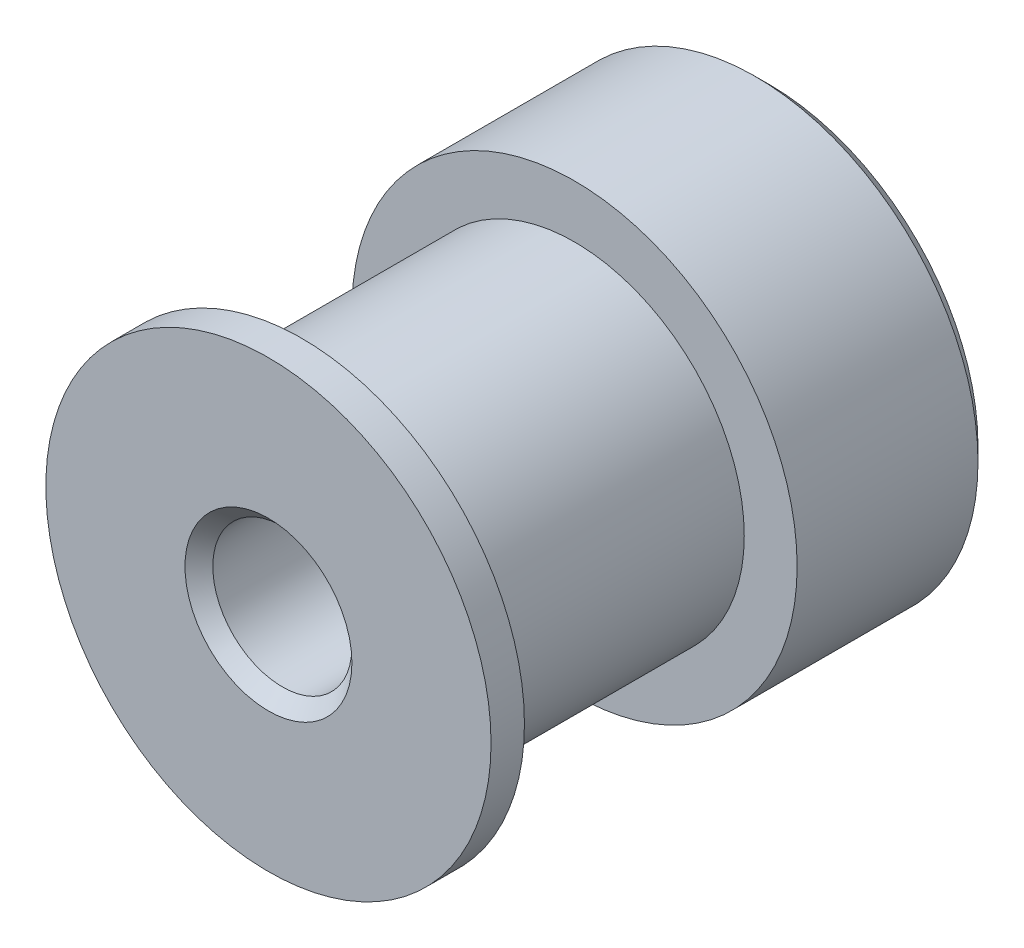
ISO-10303-21;
HEADER;
FILE_DESCRIPTION(('STEP AP214'),'2;1');
FILE_NAME('part.step','',(''),(''),'','','');
FILE_SCHEMA(('AUTOMOTIVE_DESIGN { 1 0 10303 214 1 1 1 1 }'));
ENDSEC;
DATA;
#1=APPLICATION_CONTEXT('core data for automotive mechanical design processes');
#2=APPLICATION_PROTOCOL_DEFINITION('international standard','automotive_design',2000,#1);
#3=PRODUCT_CONTEXT('',#1,'mechanical');
#4=PRODUCT('Part','Part','',(#3));
#5=PRODUCT_RELATED_PRODUCT_CATEGORY('part','',(#4));
#6=PRODUCT_DEFINITION_FORMATION('','',#4);
#7=PRODUCT_DEFINITION_CONTEXT('part definition',#1,'design');
#8=PRODUCT_DEFINITION('design','',#6,#7);
#9=PRODUCT_DEFINITION_SHAPE('','',#8);
#10=(LENGTH_UNIT() NAMED_UNIT(*) SI_UNIT(.MILLI.,.METRE.));
#11=(NAMED_UNIT(*) PLANE_ANGLE_UNIT() SI_UNIT($,.RADIAN.));
#12=(NAMED_UNIT(*) SI_UNIT($,.STERADIAN.) SOLID_ANGLE_UNIT());
#13=UNCERTAINTY_MEASURE_WITH_UNIT(LENGTH_MEASURE(1.E-05),#10,'distance_accuracy_value','');
#14=(GEOMETRIC_REPRESENTATION_CONTEXT(3) GLOBAL_UNCERTAINTY_ASSIGNED_CONTEXT((#13)) GLOBAL_UNIT_ASSIGNED_CONTEXT((#10,
#11,#12)) REPRESENTATION_CONTEXT('',''));
#15=CARTESIAN_POINT('',(0.,0.,0.));
#16=DIRECTION('',(0.,0.,1.));
#17=DIRECTION('',(1.,0.,0.));
#18=AXIS2_PLACEMENT_3D('',#15,#16,#17);
#19=CARTESIAN_POINT('',(0.,0.,7.));
#20=DIRECTION('',(0.,0.,1.));
#21=DIRECTION('',(1.,0.,0.));
#22=AXIS2_PLACEMENT_3D('',#19,#20,#21);
#23=PLANE('',#22);
#24=CARTESIAN_POINT('',(0.,0.,7.));
#25=DIRECTION('',(0.,0.,1.));
#26=DIRECTION('',(1.,0.,0.));
#27=AXIS2_PLACEMENT_3D('',#24,#25,#26);
#28=CIRCLE('',#27,8.);
#29=CARTESIAN_POINT('',(8.,0.,7.));
#30=VERTEX_POINT('',#29);
#31=EDGE_CURVE('E140',#30,#30,#28,.T.);
#32=ORIENTED_EDGE('',*,*,#31,.T.);
#33=EDGE_LOOP('',(#32));
#34=FACE_BOUND('',#33,.T.);
#35=CARTESIAN_POINT('',(0.,0.,7.));
#36=DIRECTION('',(0.,0.,1.));
#37=DIRECTION('',(1.,0.,0.));
#38=AXIS2_PLACEMENT_3D('',#35,#36,#37);
#39=CIRCLE('',#38,6.1);
#40=CARTESIAN_POINT('',(6.1,0.,7.));
#41=VERTEX_POINT('',#40);
#42=EDGE_CURVE('E131',#41,#41,#39,.T.);
#43=ORIENTED_EDGE('',*,*,#42,.F.);
#44=EDGE_LOOP('',(#43));
#45=FACE_BOUND('',#44,.T.);
#46=ADVANCED_FACE('F31',(#34,#45),#23,.T.);
#47=CARTESIAN_POINT('',(0.,0.,7.));
#48=DIRECTION('',(0.,0.,-1.));
#49=DIRECTION('',(-1.,0.,0.));
#50=AXIS2_PLACEMENT_3D('',#47,#48,#49);
#51=CYLINDRICAL_SURFACE('',#50,8.);
#52=CARTESIAN_POINT('',(0.,-8.,5.));
#53=CARTESIAN_POINT('',(0.0834717464654712,-7.99999848833852,4.99999681041172));
#54=CARTESIAN_POINT('',(0.166984992730099,-7.99868009921714,4.99300892338062));
#55=CARTESIAN_POINT('',(0.331658129841798,-7.9935478589052,4.96526000488165));
#56=CARTESIAN_POINT('',(0.412815974152226,-7.98973190166897,4.94448734936027));
#57=CARTESIAN_POINT('',(0.570372961851801,-7.98003138765458,4.88982729874066));
#58=CARTESIAN_POINT('',(0.646776330685344,-7.97414869946483,4.85595174754746));
#59=CARTESIAN_POINT('',(0.792807973094006,-7.96095710599783,4.77608112307718));
#60=CARTESIAN_POINT('',(0.862436794477323,-7.9536483161829,4.73008703085518));
#61=CARTESIAN_POINT('',(0.993783715930503,-7.93831336430504,4.62670023199632));
#62=CARTESIAN_POINT('',(1.05540895503183,-7.93028034856351,4.56919055532986));
#63=CARTESIAN_POINT('',(1.16819606135369,-7.9144531845865,4.44465669091244));
#64=CARTESIAN_POINT('',(1.21935717689242,-7.90665905354527,4.37763182023071));
#65=CARTESIAN_POINT('',(1.31014998665793,-7.89212551245005,4.23531391163603));
#66=CARTESIAN_POINT('',(1.34968721969605,-7.88539493886182,4.15995962968276));
#67=CARTESIAN_POINT('',(1.41550524332283,-7.87384713211987,4.00353108482321));
#68=CARTESIAN_POINT('',(1.44178717713098,-7.86902973396962,3.92245731588878));
#69=CARTESIAN_POINT('',(1.480050535035,-7.8619226957455,3.75788476908559));
#70=CARTESIAN_POINT('',(1.49219390192039,-7.85960445366405,3.67442490279654));
#71=CARTESIAN_POINT('',(1.50233808095346,-7.85767197152761,3.50662261519175));
#72=CARTESIAN_POINT('',(1.50034016135374,-7.8580574889876,3.4222802736977));
#73=CARTESIAN_POINT('',(1.48238979602362,-7.86146292701753,3.25628047473395));
#74=CARTESIAN_POINT('',(1.46662149996045,-7.86444808147334,3.17460228569985));
#75=CARTESIAN_POINT('',(1.42186799396207,-7.87266183284666,3.01507158021739));
#76=CARTESIAN_POINT('',(1.39288222239499,-7.87789052509516,2.9372192264907));
#77=CARTESIAN_POINT('',(1.322336471793,-7.89003855292589,2.78701132099974));
#78=CARTESIAN_POINT('',(1.28070213532456,-7.89696783823366,2.71469152941919));
#79=CARTESIAN_POINT('',(1.18609368930416,-7.91172971602918,2.57799527145977));
#80=CARTESIAN_POINT('',(1.13311842889266,-7.91956240015522,2.5136196122852));
#81=CARTESIAN_POINT('',(1.01633905685298,-7.93540001272164,2.39357504432754));
#82=CARTESIAN_POINT('',(0.952377436860683,-7.94340571024031,2.33805934754826));
#83=CARTESIAN_POINT('',(0.815968037098827,-7.95857386108318,2.2385227593246));
#84=CARTESIAN_POINT('',(0.74352017225577,-7.96573630595245,2.19450198312958));
#85=CARTESIAN_POINT('',(0.592034988874669,-7.97842539677509,2.11918224612998));
#86=CARTESIAN_POINT('',(0.512989564446494,-7.98394999136289,2.08789922088211));
#87=CARTESIAN_POINT('',(0.350639115398697,-7.99272505402719,2.03909790690784));
#88=CARTESIAN_POINT('',(0.267334544277787,-7.99597576367994,2.02157815595464));
#89=CARTESIAN_POINT('',(0.100148652903385,-7.99980360641981,2.00101396898173));
#90=CARTESIAN_POINT('',(0.0162940126341354,-8.00041950912279,1.99775960847027));
#91=CARTESIAN_POINT('',(-0.150761248092184,-7.99901543598228,2.00525547954765));
#92=CARTESIAN_POINT('',(-0.233961900480385,-7.99699558964431,2.01600502306526));
#93=CARTESIAN_POINT('',(-0.396681573218216,-7.99057111500406,2.05102903518337));
#94=CARTESIAN_POINT('',(-0.476224261046062,-7.98618522374031,2.07519728253781));
#95=CARTESIAN_POINT('',(-0.630128631824632,-7.97551842212498,2.13625770677879));
#96=CARTESIAN_POINT('',(-0.704489962595102,-7.96923738311334,2.17315074756579));
#97=CARTESIAN_POINT('',(-0.846816671513213,-7.95538030357666,2.25907812815951));
#98=CARTESIAN_POINT('',(-0.91470327701512,-7.94779086174563,2.30824073853684));
#99=CARTESIAN_POINT('',(-1.04133832326454,-7.93219343489712,2.41713813736236));
#100=CARTESIAN_POINT('',(-1.10008590976087,-7.92418541084687,2.47687391300133));
#101=CARTESIAN_POINT('',(-1.20757295872048,-7.9085247569745,2.60617231891143));
#102=CARTESIAN_POINT('',(-1.25616916218577,-7.90087825860257,2.67585490812539));
#103=CARTESIAN_POINT('',(-1.34096675057787,-7.88692985578532,2.82251762452375));
#104=CARTESIAN_POINT('',(-1.37716859613924,-7.8806279013735,2.89949748037047));
#105=CARTESIAN_POINT('',(-1.43594673512823,-7.87013024209574,3.05820586724254));
#106=CARTESIAN_POINT('',(-1.45858868794786,-7.86592440436878,3.13990937955933));
#107=CARTESIAN_POINT('',(-1.48980679326235,-7.86007203802415,3.3060472225214));
#108=CARTESIAN_POINT('',(-1.49838453270708,-7.8584252206579,3.3904812439704));
#109=CARTESIAN_POINT('',(-1.50117762148355,-7.85789199803857,3.55824833144151));
#110=CARTESIAN_POINT('',(-1.49561895003499,-7.85896215974293,3.641577580957));
#111=CARTESIAN_POINT('',(-1.47079175378803,-7.86364600659998,3.80609142204529));
#112=CARTESIAN_POINT('',(-1.45152331089332,-7.86725967655747,3.88727602642744));
#113=CARTESIAN_POINT('',(-1.39991887583263,-7.8766050802318,4.04507448479548));
#114=CARTESIAN_POINT('',(-1.36760735397252,-7.88233284594965,4.12169659134577));
#115=CARTESIAN_POINT('',(-1.29085868912204,-7.8952638755184,4.26846825424084));
#116=CARTESIAN_POINT('',(-1.24642068948186,-7.90246724360119,4.33861735284478));
#117=CARTESIAN_POINT('',(-1.14589487339535,-7.91767266107745,4.47158368004229));
#118=CARTESIAN_POINT('',(-1.08964259864303,-7.92568505353043,4.5342754125671));
#119=CARTESIAN_POINT('',(-0.967427926742291,-7.94152833918735,4.64940516246452));
#120=CARTESIAN_POINT('',(-0.901463301891616,-7.94935919027328,4.70184082098014));
#121=CARTESIAN_POINT('',(-0.760984945071873,-7.96403975968049,4.79541095262706));
#122=CARTESIAN_POINT('',(-0.686399590640517,-7.97088000990561,4.83643942849064));
#123=CARTESIAN_POINT('',(-0.531290113653834,-7.98271619380687,4.90531763660513));
#124=CARTESIAN_POINT('',(-0.450771651705248,-7.98771385879037,4.93317974704691));
#125=CARTESIAN_POINT('',(-0.308347202825154,-7.99428290707632,4.96927731441867));
#126=CARTESIAN_POINT('',(-0.24727381025187,-7.99641470878206,4.9807786303128));
#127=CARTESIAN_POINT('',(-0.124141247115157,-7.9992737995401,4.99614106211645));
#128=CARTESIAN_POINT('',(-0.0620821016527089,-8.00000112429805,5.00000237225591));
#129=CARTESIAN_POINT('',(0.,-8.,5.));
#130=B_SPLINE_CURVE_WITH_KNOTS('',3,(#52,#53,#54,#55,#56,#57,#58,#59,#60,#61,#62,#63,#64,#65,
#66,#67,#68,#69,#70,#71,#72,#73,#74,#75,#76,#77,#78,#79,#80,#81,#82,#83,#84,#85,#86,#87,#88,#89,
#90,#91,#92,#93,#94,#95,#96,#97,#98,#99,#100,#101,#102,#103,#104,#105,#106,#107,#108,#109,#110,
#111,#112,#113,#114,#115,#116,#117,#118,#119,#120,#121,#122,#123,#124,#125,#126,#127,#128,#129),
.UNSPECIFIED.,.T.,.F.,(4,2,2,2,2,2,2,2,2,2,2,2,2,2,2,2,2,2,2,2,2,2,2,2,2,2,2,2,2,2,2,2,2,2,2,2,
2,2,4),(0.,0.250188200964924,0.500587642535452,0.750761271230907,1.00091465336891,
1.2537511801363,1.50660586283617,1.76146190504358,2.01629596311948,2.26818151445336,
2.52004447587256,2.76859000612766,3.01714609846787,3.26719262629531,3.51726454049859,
3.77127768464077,4.02529337544948,4.27962588321699,4.53393136673745,4.78448174076097,
5.03501980464583,5.28360233907828,5.53220175338032,5.78351778017708,6.03485728413098,
6.28953436987299,6.54420198954945,6.79762627818559,7.05102196946513,7.30039252231748,
7.54976158541507,7.79866496207692,8.04758592655423,8.3002336996638,8.55293951262255,
8.80792048916314,9.06266126931173,9.24874344524409,9.4348208903954),.UNSPECIFIED.);
#131=CARTESIAN_POINT('',(0.,-8.,5.));
#132=VERTEX_POINT('',#131);
#133=EDGE_CURVE('E57',#132,#132,#130,.T.);
#134=ORIENTED_EDGE('',*,*,#133,.T.);
#135=EDGE_LOOP('',(#134));
#136=FACE_BOUND('',#135,.T.);
#137=CARTESIAN_POINT('',(-8.,0.,2.));
#138=CARTESIAN_POINT('',(-7.99999848833852,0.0834717464654704,2.00000318958828));
#139=CARTESIAN_POINT('',(-7.99868009921714,0.166984992730098,2.00699107661938));
#140=CARTESIAN_POINT('',(-7.9935478589052,0.331658129841797,2.03473999511835));
#141=CARTESIAN_POINT('',(-7.98973190166897,0.412815974152225,2.05551265063973));
#142=CARTESIAN_POINT('',(-7.98003138765458,0.570372961851801,2.11017270125934));
#143=CARTESIAN_POINT('',(-7.97414869946483,0.646776330685343,2.14404825245254));
#144=CARTESIAN_POINT('',(-7.96095710599783,0.792807973094006,2.22391887692282));
#145=CARTESIAN_POINT('',(-7.9536483161829,0.862436794477322,2.26991296914482));
#146=CARTESIAN_POINT('',(-7.93831336430504,0.993783715930502,2.37329976800368));
#147=CARTESIAN_POINT('',(-7.93028034856351,1.05540895503183,2.43080944467014));
#148=CARTESIAN_POINT('',(-7.9144531845865,1.16819606135369,2.55534330908756));
#149=CARTESIAN_POINT('',(-7.90665905354527,1.21935717689241,2.62236817976929));
#150=CARTESIAN_POINT('',(-7.89212551245005,1.31014998665793,2.76468608836397));
#151=CARTESIAN_POINT('',(-7.88539493886182,1.34968721969605,2.84004037031724));
#152=CARTESIAN_POINT('',(-7.87384713211987,1.41550524332283,2.99646891517679));
#153=CARTESIAN_POINT('',(-7.86902973396962,1.44178717713098,3.07754268411122));
#154=CARTESIAN_POINT('',(-7.8619226957455,1.480050535035,3.24211523091441));
#155=CARTESIAN_POINT('',(-7.85960445366405,1.49219390192039,3.32557509720346));
#156=CARTESIAN_POINT('',(-7.85767197152761,1.50233808095346,3.49337738480825));
#157=CARTESIAN_POINT('',(-7.8580574889876,1.50034016135374,3.5777197263023));
#158=CARTESIAN_POINT('',(-7.86146292701753,1.48238979602362,3.74371952526605));
#159=CARTESIAN_POINT('',(-7.86444808147334,1.46662149996045,3.82539771430015));
#160=CARTESIAN_POINT('',(-7.87266183284666,1.42186799396207,3.98492841978261));
#161=CARTESIAN_POINT('',(-7.87789052509516,1.39288222239499,4.0627807735093));
#162=CARTESIAN_POINT('',(-7.89003855292589,1.322336471793,4.21298867900026));
#163=CARTESIAN_POINT('',(-7.89696783823366,1.28070213532456,4.28530847058081));
#164=CARTESIAN_POINT('',(-7.91172971602918,1.18609368930416,4.42200472854023));
#165=CARTESIAN_POINT('',(-7.91956240015522,1.13311842889266,4.4863803877148));
#166=CARTESIAN_POINT('',(-7.93540001272164,1.01633905685298,4.60642495567246));
#167=CARTESIAN_POINT('',(-7.9434057102403,0.952377436860682,4.66194065245174));
#168=CARTESIAN_POINT('',(-7.95857386108318,0.815968037098826,4.76147724067541));
#169=CARTESIAN_POINT('',(-7.96573630595245,0.743520172255769,4.80549801687042));
#170=CARTESIAN_POINT('',(-7.97842539677509,0.592034988874667,4.88081775387002));
#171=CARTESIAN_POINT('',(-7.98394999136289,0.512989564446493,4.9121007791179));
#172=CARTESIAN_POINT('',(-7.99272505402719,0.350639115398696,4.96090209309216));
#173=CARTESIAN_POINT('',(-7.99597576367994,0.267334544277786,4.97842184404536));
#174=CARTESIAN_POINT('',(-7.99980360641981,0.100148652903385,4.99898603101827));
#175=CARTESIAN_POINT('',(-8.00041950912279,0.0162940126341347,5.00224039152973));
#176=CARTESIAN_POINT('',(-7.99901543598228,-0.150761248092184,4.99474452045235));
#177=CARTESIAN_POINT('',(-7.99699558964431,-0.233961900480386,4.98399497693474));
#178=CARTESIAN_POINT('',(-7.99057111500406,-0.396681573218218,4.94897096481663));
#179=CARTESIAN_POINT('',(-7.98618522374031,-0.476224261046064,4.92480271746219));
#180=CARTESIAN_POINT('',(-7.97551842212498,-0.630128631824633,4.86374229322121));
#181=CARTESIAN_POINT('',(-7.96923738311334,-0.704489962595103,4.82684925243421));
#182=CARTESIAN_POINT('',(-7.95538030357666,-0.846816671513214,4.74092187184049));
#183=CARTESIAN_POINT('',(-7.94779086174563,-0.914703277015122,4.69175926146316));
#184=CARTESIAN_POINT('',(-7.93219343489712,-1.04133832326455,4.58286186263764));
#185=CARTESIAN_POINT('',(-7.92418541084687,-1.10008590976087,4.52312608699867));
#186=CARTESIAN_POINT('',(-7.9085247569745,-1.20757295872048,4.39382768108857));
#187=CARTESIAN_POINT('',(-7.90087825860257,-1.25616916218577,4.32414509187461));
#188=CARTESIAN_POINT('',(-7.88692985578532,-1.34096675057787,4.17748237547625));
#189=CARTESIAN_POINT('',(-7.8806279013735,-1.37716859613924,4.10050251962953));
#190=CARTESIAN_POINT('',(-7.87013024209574,-1.43594673512823,3.94179413275746));
#191=CARTESIAN_POINT('',(-7.86592440436878,-1.45858868794786,3.86009062044067));
#192=CARTESIAN_POINT('',(-7.86007203802415,-1.48980679326236,3.6939527774786));
#193=CARTESIAN_POINT('',(-7.8584252206579,-1.49838453270708,3.6095187560296));
#194=CARTESIAN_POINT('',(-7.85789199803857,-1.50117762148355,3.44175166855849));
#195=CARTESIAN_POINT('',(-7.85896215974293,-1.49561895003499,3.358422419043));
#196=CARTESIAN_POINT('',(-7.86364600659998,-1.47079175378803,3.19390857795471));
#197=CARTESIAN_POINT('',(-7.86725967655747,-1.45152331089332,3.11272397357256));
#198=CARTESIAN_POINT('',(-7.8766050802318,-1.39991887583263,2.95492551520452));
#199=CARTESIAN_POINT('',(-7.88233284594965,-1.36760735397252,2.87830340865423));
#200=CARTESIAN_POINT('',(-7.8952638755184,-1.29085868912204,2.73153174575916));
#201=CARTESIAN_POINT('',(-7.90246724360119,-1.24642068948186,2.66138264715522));
#202=CARTESIAN_POINT('',(-7.91767266107745,-1.14589487339535,2.52841631995771));
#203=CARTESIAN_POINT('',(-7.92568505353043,-1.08964259864304,2.4657245874329));
#204=CARTESIAN_POINT('',(-7.94152833918735,-0.967427926742291,2.35059483753548));
#205=CARTESIAN_POINT('',(-7.94935919027328,-0.901463301891616,2.29815917901986));
#206=CARTESIAN_POINT('',(-7.96403975968049,-0.760984945071873,2.20458904737294));
#207=CARTESIAN_POINT('',(-7.97088000990561,-0.686399590640517,2.16356057150936));
#208=CARTESIAN_POINT('',(-7.98271619380687,-0.531290113653835,2.09468236339487));
#209=CARTESIAN_POINT('',(-7.98771385879037,-0.450771651705249,2.06682025295309));
#210=CARTESIAN_POINT('',(-7.99428290707632,-0.308347202825155,2.03072268558133));
#211=CARTESIAN_POINT('',(-7.99641470878206,-0.247273810251872,2.0192213696872));
#212=CARTESIAN_POINT('',(-7.9992737995401,-0.124141247115159,2.00385893788355));
#213=CARTESIAN_POINT('',(-8.00000112429805,-0.0620821016527104,1.99999762774409));
#214=CARTESIAN_POINT('',(-8.,0.,2.));
#215=B_SPLINE_CURVE_WITH_KNOTS('',3,(#137,#138,#139,#140,#141,#142,#143,#144,#145,#146,#147,
#148,#149,#150,#151,#152,#153,#154,#155,#156,#157,#158,#159,#160,#161,#162,#163,#164,#165,#166,
#167,#168,#169,#170,#171,#172,#173,#174,#175,#176,#177,#178,#179,#180,#181,#182,#183,#184,#185,
#186,#187,#188,#189,#190,#191,#192,#193,#194,#195,#196,#197,#198,#199,#200,#201,#202,#203,#204,
#205,#206,#207,#208,#209,#210,#211,#212,#213,#214),.UNSPECIFIED.,.T.,.F.,(4,2,2,2,2,2,2,2,2,2,2,
2,2,2,2,2,2,2,2,2,2,2,2,2,2,2,2,2,2,2,2,2,2,2,2,2,2,2,4),(0.,0.250188200964924,
0.500587642535452,0.750761271230907,1.00091465336891,1.2537511801363,1.50660586283617,
1.76146190504357,2.01629596311948,2.26818151445336,2.52004447587256,2.76859000612765,
3.01714609846786,3.26719262629531,3.51726454049859,3.77127768464077,4.02529337544948,
4.27962588321699,4.53393136673745,4.78448174076097,5.03501980464584,5.28360233907828,
5.53220175338032,5.78351778017708,6.03485728413098,6.28953436987299,6.54420198954945,
6.79762627818559,7.05102196946513,7.30039252231748,7.54976158541507,7.79866496207693,
8.04758592655423,8.3002336996638,8.55293951262256,8.80792048916315,9.06266126931173,
9.24874344524409,9.43482089039541),.UNSPECIFIED.);
#216=CARTESIAN_POINT('',(-8.,0.,2.));
#217=VERTEX_POINT('',#216);
#218=EDGE_CURVE('E56',#217,#217,#215,.T.);
#219=ORIENTED_EDGE('',*,*,#218,.T.);
#220=EDGE_LOOP('',(#219));
#221=FACE_BOUND('',#220,.T.);
#222=CARTESIAN_POINT('',(0.,0.,0.5));
#223=DIRECTION('',(0.,0.,1.));
#224=DIRECTION('',(1.,0.,0.));
#225=AXIS2_PLACEMENT_3D('',#222,#223,#224);
#226=CIRCLE('',#225,8.);
#227=CARTESIAN_POINT('',(8.,0.,0.5));
#228=VERTEX_POINT('',#227);
#229=EDGE_CURVE('E143',#228,#228,#226,.T.);
#230=ORIENTED_EDGE('',*,*,#229,.T.);
#231=EDGE_LOOP('',(#230));
#232=FACE_BOUND('',#231,.T.);
#233=ORIENTED_EDGE('',*,*,#31,.F.);
#234=EDGE_LOOP('',(#233));
#235=FACE_BOUND('',#234,.T.);
#236=ADVANCED_FACE('F80',(#136,#221,#232,#235),#51,.T.);
#237=CARTESIAN_POINT('',(0.,0.,0.));
#238=DIRECTION('',(0.,0.,1.));
#239=DIRECTION('',(1.,0.,0.));
#240=AXIS2_PLACEMENT_3D('',#237,#238,#239);
#241=PLANE('',#240);
#242=CARTESIAN_POINT('',(0.,0.,0.));
#243=DIRECTION('',(0.,0.,1.));
#244=DIRECTION('',(1.,0.,0.));
#245=AXIS2_PLACEMENT_3D('',#242,#243,#244);
#246=CIRCLE('',#245,7.5);
#247=CARTESIAN_POINT('',(7.5,0.,0.));
#248=VERTEX_POINT('',#247);
#249=EDGE_CURVE('E149',#248,#248,#246,.F.);
#250=ORIENTED_EDGE('',*,*,#249,.T.);
#251=EDGE_LOOP('',(#250));
#252=FACE_BOUND('',#251,.T.);
#253=CARTESIAN_POINT('',(0.,0.,0.));
#254=DIRECTION('',(0.,0.,1.));
#255=DIRECTION('',(1.,0.,0.));
#256=AXIS2_PLACEMENT_3D('',#253,#254,#255);
#257=CIRCLE('',#256,3.);
#258=CARTESIAN_POINT('',(3.,0.,0.));
#259=VERTEX_POINT('',#258);
#260=EDGE_CURVE('E146',#259,#259,#257,.T.);
#261=ORIENTED_EDGE('',*,*,#260,.T.);
#262=EDGE_LOOP('',(#261));
#263=FACE_BOUND('',#262,.T.);
#264=ADVANCED_FACE('F85',(#252,#263),#241,.F.);
#265=CARTESIAN_POINT('',(0.,0.,16.8));
#266=DIRECTION('',(0.,0.,-1.));
#267=DIRECTION('',(-1.,0.,0.));
#268=AXIS2_PLACEMENT_3D('',#265,#266,#267);
#269=CYLINDRICAL_SURFACE('',#268,6.1);
#270=CARTESIAN_POINT('',(0.,0.,16.8));
#271=DIRECTION('',(0.,0.,1.));
#272=DIRECTION('',(1.,0.,0.));
#273=AXIS2_PLACEMENT_3D('',#270,#271,#272);
#274=CIRCLE('',#273,6.1);
#275=CARTESIAN_POINT('',(6.1,0.,16.8));
#276=VERTEX_POINT('',#275);
#277=EDGE_CURVE('E133',#276,#276,#274,.T.);
#278=ORIENTED_EDGE('',*,*,#277,.F.);
#279=EDGE_LOOP('',(#278));
#280=FACE_BOUND('',#279,.T.);
#281=ORIENTED_EDGE('',*,*,#42,.T.);
#282=EDGE_LOOP('',(#281));
#283=FACE_BOUND('',#282,.T.);
#284=ADVANCED_FACE('F109',(#280,#283),#269,.T.);
#285=CARTESIAN_POINT('',(0.,0.,16.8));
#286=DIRECTION('',(0.,0.,1.));
#287=DIRECTION('',(1.,0.,0.));
#288=AXIS2_PLACEMENT_3D('',#285,#286,#287);
#289=PLANE('',#288);
#290=CARTESIAN_POINT('',(0.,0.,16.8));
#291=DIRECTION('',(0.,0.,1.));
#292=DIRECTION('',(1.,0.,0.));
#293=AXIS2_PLACEMENT_3D('',#290,#291,#292);
#294=CIRCLE('',#293,8.);
#295=CARTESIAN_POINT('',(8.,0.,16.8));
#296=VERTEX_POINT('',#295);
#297=EDGE_CURVE('E75',#296,#296,#294,.T.);
#298=ORIENTED_EDGE('',*,*,#297,.F.);
#299=EDGE_LOOP('',(#298));
#300=FACE_BOUND('',#299,.T.);
#301=ORIENTED_EDGE('',*,*,#277,.T.);
#302=EDGE_LOOP('',(#301));
#303=FACE_BOUND('',#302,.T.);
#304=ADVANCED_FACE('F112',(#300,#303),#289,.F.);
#305=CARTESIAN_POINT('',(0.,0.,18.));
#306=DIRECTION('',(0.,0.,-1.));
#307=DIRECTION('',(-1.,0.,0.));
#308=AXIS2_PLACEMENT_3D('',#305,#306,#307);
#309=CYLINDRICAL_SURFACE('',#308,8.);
#310=CARTESIAN_POINT('',(0.,0.,18.));
#311=DIRECTION('',(0.,0.,1.));
#312=DIRECTION('',(1.,0.,0.));
#313=AXIS2_PLACEMENT_3D('',#310,#311,#312);
#314=CIRCLE('',#313,8.);
#315=CARTESIAN_POINT('',(8.,0.,18.));
#316=VERTEX_POINT('',#315);
#317=EDGE_CURVE('E78',#316,#316,#314,.T.);
#318=ORIENTED_EDGE('',*,*,#317,.F.);
#319=EDGE_LOOP('',(#318));
#320=FACE_BOUND('',#319,.T.);
#321=ORIENTED_EDGE('',*,*,#297,.T.);
#322=EDGE_LOOP('',(#321));
#323=FACE_BOUND('',#322,.T.);
#324=ADVANCED_FACE('F114',(#320,#323),#309,.T.);
#325=CARTESIAN_POINT('',(0.,0.,18.));
#326=DIRECTION('',(0.,0.,1.));
#327=DIRECTION('',(1.,0.,0.));
#328=AXIS2_PLACEMENT_3D('',#325,#326,#327);
#329=PLANE('',#328);
#330=CARTESIAN_POINT('',(0.,0.,18.));
#331=DIRECTION('',(0.,0.,1.));
#332=DIRECTION('',(1.,0.,0.));
#333=AXIS2_PLACEMENT_3D('',#330,#331,#332);
#334=CIRCLE('',#333,3.00000000000001);
#335=CARTESIAN_POINT('',(3.00000000000001,0.,18.));
#336=VERTEX_POINT('',#335);
#337=EDGE_CURVE('E10',#336,#336,#334,.F.);
#338=ORIENTED_EDGE('',*,*,#337,.T.);
#339=EDGE_LOOP('',(#338));
#340=FACE_BOUND('',#339,.T.);
#341=ORIENTED_EDGE('',*,*,#317,.T.);
#342=EDGE_LOOP('',(#341));
#343=FACE_BOUND('',#342,.T.);
#344=ADVANCED_FACE('F117',(#340,#343),#329,.T.);
#345=CARTESIAN_POINT('',(0.,0.,0.));
#346=DIRECTION('',(0.,0.,1.));
#347=DIRECTION('',(1.,0.,0.));
#348=AXIS2_PLACEMENT_3D('',#345,#346,#347);
#349=CYLINDRICAL_SURFACE('',#348,2.5);
#350=CARTESIAN_POINT('',(0.,-2.5,5.));
#351=CARTESIAN_POINT('',(-0.0767298334620154,-2.49999625789732,4.99999590899012));
#352=CARTESIAN_POINT('',(-0.153582320644177,-2.4964290461501,4.99407132907373));
#353=CARTESIAN_POINT('',(-0.304975509530678,-2.48249903608568,4.97067568048467));
#354=CARTESIAN_POINT('',(-0.379510034596047,-2.47211948032719,4.95317613814578));
#355=CARTESIAN_POINT('',(-0.523751827790836,-2.44561558054488,4.90761363883314));
#356=CARTESIAN_POINT('',(-0.593481028226565,-2.42951973272944,4.87960304183684));
#357=CARTESIAN_POINT('',(-0.727030318214658,-2.39295367626407,4.81413966685897));
#358=CARTESIAN_POINT('',(-0.790851869416382,-2.37248455380255,4.77668923303125));
#359=CARTESIAN_POINT('',(-0.916299278999314,-2.32705360719088,4.69022517329142));
#360=CARTESIAN_POINT('',(-0.977384020081415,-2.30186792195985,4.64054630464861));
#361=CARTESIAN_POINT('',(-1.09088270411891,-2.25030439279634,4.53253279617173));
#362=CARTESIAN_POINT('',(-1.14328534948112,-2.22392505153571,4.47418706281268));
#363=CARTESIAN_POINT('',(-1.24444996762974,-2.1691106699591,4.34207648950327));
#364=CARTESIAN_POINT('',(-1.29197766378809,-2.14082017703649,4.26729822901871));
#365=CARTESIAN_POINT('',(-1.37361437764896,-2.08938301412124,4.10915342675689));
#366=CARTESIAN_POINT('',(-1.4077451733516,-2.06622802273938,4.02580110375243));
#367=CARTESIAN_POINT('',(-1.45440601714221,-2.0335462966093,3.87340354934676));
#368=CARTESIAN_POINT('',(-1.47016197246826,-2.02207883137591,3.80576400138968));
#369=CARTESIAN_POINT('',(-1.49216172340475,-2.00590308295503,3.66819628416964));
#370=CARTESIAN_POINT('',(-1.49841734556836,-2.0011863964376,3.59827107124551));
#371=CARTESIAN_POINT('',(-1.50105508796009,-1.99920922463856,3.45798850578266));
#372=CARTESIAN_POINT('',(-1.49741783408418,-2.00196337012718,3.3876305749068));
#373=CARTESIAN_POINT('',(-1.48046060478828,-2.01453261443741,3.24872122457241));
#374=CARTESIAN_POINT('',(-1.46713334620103,-2.02435302432226,3.18017120415256));
#375=CARTESIAN_POINT('',(-1.43173921881792,-2.04953186944258,3.04746975787189));
#376=CARTESIAN_POINT('',(-1.40978748666087,-2.06481711652537,2.98327294607552));
#377=CARTESIAN_POINT('',(-1.35795061770837,-2.09927051350828,2.85930500907188));
#378=CARTESIAN_POINT('',(-1.32806257259705,-2.11844008623465,2.79953551657607));
#379=CARTESIAN_POINT('',(-1.25517983184583,-2.16255327268985,2.6750159028772));
#380=CARTESIAN_POINT('',(-1.21080724397723,-2.18792043372992,2.61122190704507));
#381=CARTESIAN_POINT('',(-1.11291092784003,-2.23930599764381,2.49132351633298));
#382=CARTESIAN_POINT('',(-1.05937845100578,-2.26532500262149,2.43522656602349));
#383=CARTESIAN_POINT('',(-0.935811834382964,-2.31935504958317,2.32438701817824));
#384=CARTESIAN_POINT('',(-0.864517682704955,-2.34713836268533,2.27092269398401));
#385=CARTESIAN_POINT('',(-0.712276050458998,-2.39772428433981,2.17687795280209));
#386=CARTESIAN_POINT('',(-0.631333763943561,-2.42052955425515,2.13629064621005));
#387=CARTESIAN_POINT('',(-0.467197585268203,-2.45730392066151,2.0720678172041));
#388=CARTESIAN_POINT('',(-0.384467624173577,-2.47173957439704,2.04752464428409));
#389=CARTESIAN_POINT('',(-0.215047895144637,-2.49218842813551,2.01298880259462));
#390=CARTESIAN_POINT('',(-0.128363005661317,-2.49821172952738,2.00297868224642));
#391=CARTESIAN_POINT('',(0.033714614377398,-2.5009057037461,1.99849215232169));
#392=CARTESIAN_POINT('',(0.109042473418719,-2.49873521714286,2.00209114491483));
#393=CARTESIAN_POINT('',(0.257829401986062,-2.48778712087048,2.02042585307192));
#394=CARTESIAN_POINT('',(0.331288509376107,-2.47900964518037,2.03516134280581));
#395=CARTESIAN_POINT('',(0.472574932157614,-2.4559479244219,2.07454343281246));
#396=CARTESIAN_POINT('',(0.540495750928485,-2.44180275662555,2.09894034907347));
#397=CARTESIAN_POINT('',(0.671265749087264,-2.40913880862844,2.15667737636527));
#398=CARTESIAN_POINT('',(0.73411392496391,-2.39061916586511,2.19001925134667));
#399=CARTESIAN_POINT('',(0.860006262823865,-2.3484549623736,2.26855697920871));
#400=CARTESIAN_POINT('',(0.922394150456838,-2.3244780273988,2.31462382907839));
#401=CARTESIAN_POINT('',(1.03902603131014,-2.27474265574732,2.41539139348862));
#402=CARTESIAN_POINT('',(1.09326040273738,-2.2489821658636,2.47010215485254));
#403=CARTESIAN_POINT('',(1.19931996735579,-2.19445423909891,2.59491039003715));
#404=CARTESIAN_POINT('',(1.24991019630915,-2.16573241746291,2.6660838854655));
#405=CARTESIAN_POINT('',(1.33845238915668,-2.1121618206671,2.8172160245682));
#406=CARTESIAN_POINT('',(1.37641766769781,-2.0873089799769,2.89716529389279));
#407=CARTESIAN_POINT('',(1.43142578795776,-2.04984909240519,3.04624302230669));
#408=CARTESIAN_POINT('',(1.4512162533619,-2.03575659328729,3.11398031235859));
#409=CARTESIAN_POINT('',(1.48113663905972,-2.01409605743544,3.25253207808011));
#410=CARTESIAN_POINT('',(1.49127995297631,-2.00651897642721,3.32334214432783));
#411=CARTESIAN_POINT('',(1.50134130416631,-1.99900446616268,3.46637694759703));
#412=CARTESIAN_POINT('',(1.50122089107869,-1.99909576445937,3.53860599068704));
#413=CARTESIAN_POINT('',(1.49066472959328,-2.0069771789285,3.68189443560946));
#414=CARTESIAN_POINT('',(1.48022337215759,-2.0147714813882,3.7529531800806));
#415=CARTESIAN_POINT('',(1.45040174148913,-2.0363318524298,3.88848841757219));
#416=CARTESIAN_POINT('',(1.43147636845351,-2.04979211805581,3.95311709430687));
#417=CARTESIAN_POINT('',(1.38563242076993,-2.08105501960151,4.07833725447422));
#418=CARTESIAN_POINT('',(1.35871083588479,-2.09885929040482,4.13892720696055));
#419=CARTESIAN_POINT('',(1.29289245555732,-2.14012990550917,4.26431985722078));
#420=CARTESIAN_POINT('',(1.25279167675753,-2.16404587582639,4.32834110385431));
#421=CARTESIAN_POINT('',(1.16375698389084,-2.21320127030768,4.44938007261729));
#422=CARTESIAN_POINT('',(1.11481579607798,-2.23844177205021,4.50639196215256));
#423=CARTESIAN_POINT('',(1.00009777425734,-2.29225690291476,4.62135094913167));
#424=CARTESIAN_POINT('',(0.932876819313904,-2.32070308663658,4.67793107489619));
#425=CARTESIAN_POINT('',(0.788462434445589,-2.37365428872367,4.77909785586331));
#426=CARTESIAN_POINT('',(0.711265444501539,-2.39815789310936,4.82368021198479));
#427=CARTESIAN_POINT('',(0.551125230801453,-2.43985578654394,4.89778580757374));
#428=CARTESIAN_POINT('',(0.468430086957214,-2.45725077479787,4.92772806492683));
#429=CARTESIAN_POINT('',(0.297973306118807,-2.48366273001246,4.97272469521098));
#430=CARTESIAN_POINT('',(0.210232099648612,-2.49271125871485,4.98783516785699));
#431=CARTESIAN_POINT('',(0.101558096917536,-2.49802001168187,4.99669745470866));
#432=CARTESIAN_POINT('',(0.081276259028278,-2.49876114656362,4.9979344173061));
#433=CARTESIAN_POINT('',(0.0406658206871131,-2.49975164517367,4.99958624637086));
#434=CARTESIAN_POINT('',(0.02033721863757,-2.50000099184316,5.0000010843209));
#435=CARTESIAN_POINT('',(0.,-2.5,5.));
#436=B_SPLINE_CURVE_WITH_KNOTS('',3,(#350,#351,#352,#353,#354,#355,#356,#357,#358,#359,#360,
#361,#362,#363,#364,#365,#366,#367,#368,#369,#370,#371,#372,#373,#374,#375,#376,#377,#378,#379,
#380,#381,#382,#383,#384,#385,#386,#387,#388,#389,#390,#391,#392,#393,#394,#395,#396,#397,#398,
#399,#400,#401,#402,#403,#404,#405,#406,#407,#408,#409,#410,#411,#412,#413,#414,#415,#416,#417,
#418,#419,#420,#421,#422,#423,#424,#425,#426,#427,#428,#429,#430,#431,#432,#433,#434,#435),
.UNSPECIFIED.,.T.,.F.,(4,2,2,2,2,2,2,2,2,2,2,2,2,2,2,2,2,2,2,2,2,2,2,2,2,2,2,2,2,2,2,2,2,2,2,2,
2,2,2,2,2,2,4),(0.,0.230102237548649,0.460772627520012,0.690308884600012,0.919788197992274,
1.16681590732473,1.414162579348,1.69183813189807,1.96906040692092,2.17933829855633,
2.38935420916578,2.59978170870726,2.81036753273872,3.01823267593207,3.22617409809868,
3.47046995225163,3.71500044803674,3.99360957884691,4.27206939275324,4.5329679069656,
4.79355286918236,5.01875602722426,5.24395461863455,5.46367785689772,5.68344445659025,
5.92601365818362,6.16886690081836,6.44336762428009,6.71757792616456,6.93257787314692,
7.14727888733319,7.36278425777433,7.57840681155725,7.78364098331142,7.98895251523035,
8.22578610052286,8.46281544370208,8.73854311775519,9.01436946031985,9.28175654462677,
9.54812832184448,9.60911473335177,9.6701032602764),.UNSPECIFIED.);
#437=CARTESIAN_POINT('',(0.,-2.5,5.));
#438=VERTEX_POINT('',#437);
#439=EDGE_CURVE('E35',#438,#438,#436,.T.);
#440=ORIENTED_EDGE('',*,*,#439,.T.);
#441=EDGE_LOOP('',(#440));
#442=FACE_BOUND('',#441,.T.);
#443=CARTESIAN_POINT('',(-2.5,0.,2.));
#444=CARTESIAN_POINT('',(-2.49999625789732,-0.0767298334620163,2.00000409100988));
#445=CARTESIAN_POINT('',(-2.4964290461501,-0.153582320644178,2.00592867092626));
#446=CARTESIAN_POINT('',(-2.48249903608568,-0.304975509530679,2.02932431951533));
#447=CARTESIAN_POINT('',(-2.47211948032719,-0.379510034596047,2.04682386185422));
#448=CARTESIAN_POINT('',(-2.44561558054488,-0.523751827790837,2.09238636116686));
#449=CARTESIAN_POINT('',(-2.42951973272944,-0.593481028226566,2.12039695816316));
#450=CARTESIAN_POINT('',(-2.39295367626407,-0.727030318214659,2.18586033314103));
#451=CARTESIAN_POINT('',(-2.37248455380255,-0.790851869416383,2.22331076696875));
#452=CARTESIAN_POINT('',(-2.32705360719088,-0.916299278999315,2.30977482670858));
#453=CARTESIAN_POINT('',(-2.30186792195985,-0.977384020081416,2.35945369535139));
#454=CARTESIAN_POINT('',(-2.25030439279634,-1.09088270411891,2.46746720382827));
#455=CARTESIAN_POINT('',(-2.22392505153571,-1.14328534948112,2.52581293718732));
#456=CARTESIAN_POINT('',(-2.1691106699591,-1.24444996762974,2.65792351049673));
#457=CARTESIAN_POINT('',(-2.14082017703649,-1.29197766378809,2.73270177098129));
#458=CARTESIAN_POINT('',(-2.08938301412124,-1.37361437764896,2.89084657324311));
#459=CARTESIAN_POINT('',(-2.06622802273938,-1.4077451733516,2.97419889624757));
#460=CARTESIAN_POINT('',(-2.0335462966093,-1.45440601714222,3.12659645065324));
#461=CARTESIAN_POINT('',(-2.02207883137591,-1.47016197246827,3.19423599861032));
#462=CARTESIAN_POINT('',(-2.00590308295503,-1.49216172340475,3.33180371583036));
#463=CARTESIAN_POINT('',(-2.00118639643759,-1.49841734556836,3.40172892875449));
#464=CARTESIAN_POINT('',(-1.99920922463856,-1.50105508796009,3.54201149421734));
#465=CARTESIAN_POINT('',(-2.00196337012718,-1.49741783408419,3.6123694250932));
#466=CARTESIAN_POINT('',(-2.01453261443741,-1.48046060478828,3.75127877542759));
#467=CARTESIAN_POINT('',(-2.02435302432226,-1.46713334620103,3.81982879584744));
#468=CARTESIAN_POINT('',(-2.04953186944258,-1.43173921881792,3.9525302421281));
#469=CARTESIAN_POINT('',(-2.06481711652537,-1.40978748666087,4.01672705392448));
#470=CARTESIAN_POINT('',(-2.09927051350828,-1.35795061770837,4.14069499092812));
#471=CARTESIAN_POINT('',(-2.11844008623465,-1.32806257259705,4.20046448342392));
#472=CARTESIAN_POINT('',(-2.16255327268985,-1.25517983184583,4.3249840971228));
#473=CARTESIAN_POINT('',(-2.18792043372992,-1.21080724397723,4.38877809295493));
#474=CARTESIAN_POINT('',(-2.23930599764381,-1.11291092784003,4.50867648366701));
#475=CARTESIAN_POINT('',(-2.26532500262149,-1.05937845100579,4.56477343397651));
#476=CARTESIAN_POINT('',(-2.31935504958317,-0.935811834382967,4.67561298182176));
#477=CARTESIAN_POINT('',(-2.34713836268532,-0.864517682704958,4.72907730601599));
#478=CARTESIAN_POINT('',(-2.39772428433981,-0.712276050459001,4.82312204719791));
#479=CARTESIAN_POINT('',(-2.42052955425515,-0.631333763943565,4.86370935378995));
#480=CARTESIAN_POINT('',(-2.45730392066151,-0.467197585268207,4.9279321827959));
#481=CARTESIAN_POINT('',(-2.47173957439704,-0.384467624173581,4.95247535571591));
#482=CARTESIAN_POINT('',(-2.49218842813551,-0.215047895144641,4.98701119740538));
#483=CARTESIAN_POINT('',(-2.49821172952738,-0.12836300566132,4.99702131775357));
#484=CARTESIAN_POINT('',(-2.5009057037461,0.0337146143773954,5.00150784767831));
#485=CARTESIAN_POINT('',(-2.49873521714286,0.109042473418717,4.99790885508517));
#486=CARTESIAN_POINT('',(-2.48778712087048,0.25782940198606,4.97957414692808));
#487=CARTESIAN_POINT('',(-2.47900964518037,0.331288509376105,4.96483865719419));
#488=CARTESIAN_POINT('',(-2.4559479244219,0.472574932157612,4.92545656718754));
#489=CARTESIAN_POINT('',(-2.44180275662555,0.540495750928482,4.90105965092653));
#490=CARTESIAN_POINT('',(-2.40913880862845,0.671265749087262,4.84332262363473));
#491=CARTESIAN_POINT('',(-2.39061916586511,0.734113924963907,4.80998074865333));
#492=CARTESIAN_POINT('',(-2.3484549623736,0.860006262823863,4.7314430207913));
#493=CARTESIAN_POINT('',(-2.3244780273988,0.922394150456837,4.68537617092161));
#494=CARTESIAN_POINT('',(-2.27474265574732,1.03902603131014,4.58460860651138));
#495=CARTESIAN_POINT('',(-2.2489821658636,1.09326040273738,4.52989784514746));
#496=CARTESIAN_POINT('',(-2.19445423909891,1.19931996735579,4.40508960996285));
#497=CARTESIAN_POINT('',(-2.16573241746291,1.24991019630915,4.3339161145345));
#498=CARTESIAN_POINT('',(-2.1121618206671,1.33845238915667,4.1827839754318));
#499=CARTESIAN_POINT('',(-2.0873089799769,1.37641766769781,4.10283470610722));
#500=CARTESIAN_POINT('',(-2.04984909240519,1.43142578795776,3.95375697769331));
#501=CARTESIAN_POINT('',(-2.03575659328729,1.4512162533619,3.88601968764141));
#502=CARTESIAN_POINT('',(-2.01409605743544,1.48113663905972,3.7474679219199));
#503=CARTESIAN_POINT('',(-2.00651897642721,1.49127995297631,3.67665785567217));
#504=CARTESIAN_POINT('',(-1.99900446616268,1.50134130416631,3.53362305240297));
#505=CARTESIAN_POINT('',(-1.99909576445937,1.50122089107869,3.46139400931296));
#506=CARTESIAN_POINT('',(-2.0069771789285,1.49066472959328,3.31810556439054));
#507=CARTESIAN_POINT('',(-2.0147714813882,1.48022337215759,3.2470468199194));
#508=CARTESIAN_POINT('',(-2.0363318524298,1.45040174148913,3.11151158242781));
#509=CARTESIAN_POINT('',(-2.04979211805581,1.43147636845351,3.04688290569313));
#510=CARTESIAN_POINT('',(-2.08105501960152,1.38563242076993,2.92166274552578));
#511=CARTESIAN_POINT('',(-2.09885929040482,1.35871083588479,2.86107279303945));
#512=CARTESIAN_POINT('',(-2.14012990550917,1.29289245555732,2.73568014277922));
#513=CARTESIAN_POINT('',(-2.16404587582639,1.25279167675753,2.67165889614569));
#514=CARTESIAN_POINT('',(-2.21320127030768,1.16375698389084,2.55061992738271));
#515=CARTESIAN_POINT('',(-2.23844177205021,1.11481579607798,2.49360803784744));
#516=CARTESIAN_POINT('',(-2.29225690291476,1.00009777425734,2.37864905086833));
#517=CARTESIAN_POINT('',(-2.32070308663658,0.932876819313904,2.32206892510381));
#518=CARTESIAN_POINT('',(-2.37365428872367,0.788462434445589,2.22090214413669));
#519=CARTESIAN_POINT('',(-2.39815789310936,0.71126544450154,2.17631978801521));
#520=CARTESIAN_POINT('',(-2.43985578654394,0.551125230801454,2.10221419242626));
#521=CARTESIAN_POINT('',(-2.45725077479787,0.468430086957214,2.07227193507317));
#522=CARTESIAN_POINT('',(-2.48366273001246,0.297973306118808,2.02727530478903));
#523=CARTESIAN_POINT('',(-2.49271125871485,0.210232099648613,2.01216483214301));
#524=CARTESIAN_POINT('',(-2.49802001168187,0.101558096917536,2.00330254529134));
#525=CARTESIAN_POINT('',(-2.49876114656362,0.0812762590282776,2.0020655826939));
#526=CARTESIAN_POINT('',(-2.49975164517367,0.0406658206871122,2.00041375362914));
#527=CARTESIAN_POINT('',(-2.50000099184316,0.0203372186375691,1.9999989156791));
#528=CARTESIAN_POINT('',(-2.5,0.,2.));
#529=B_SPLINE_CURVE_WITH_KNOTS('',3,(#443,#444,#445,#446,#447,#448,#449,#450,#451,#452,#453,
#454,#455,#456,#457,#458,#459,#460,#461,#462,#463,#464,#465,#466,#467,#468,#469,#470,#471,#472,
#473,#474,#475,#476,#477,#478,#479,#480,#481,#482,#483,#484,#485,#486,#487,#488,#489,#490,#491,
#492,#493,#494,#495,#496,#497,#498,#499,#500,#501,#502,#503,#504,#505,#506,#507,#508,#509,#510,
#511,#512,#513,#514,#515,#516,#517,#518,#519,#520,#521,#522,#523,#524,#525,#526,#527,#528),
.UNSPECIFIED.,.T.,.F.,(4,2,2,2,2,2,2,2,2,2,2,2,2,2,2,2,2,2,2,2,2,2,2,2,2,2,2,2,2,2,2,2,2,2,2,2,
2,2,2,2,2,2,4),(0.,0.230102237548649,0.460772627520012,0.690308884600012,0.919788197992275,
1.16681590732473,1.414162579348,1.69183813189807,1.96906040692092,2.17933829855633,
2.38935420916578,2.59978170870726,2.81036753273872,3.01823267593207,3.22617409809868,
3.47046995225163,3.71500044803674,3.99360957884691,4.27206939275324,4.53296790696559,
4.79355286918236,5.01875602722426,5.24395461863455,5.46367785689772,5.68344445659025,
5.92601365818362,6.16886690081836,6.44336762428009,6.71757792616456,6.93257787314692,
7.14727888733318,7.36278425777433,7.57840681155725,7.78364098331142,7.98895251523035,
8.22578610052286,8.46281544370208,8.73854311775519,9.01436946031985,9.28175654462677,
9.54812832184448,9.60911473335177,9.67010326027641),.UNSPECIFIED.);
#530=CARTESIAN_POINT('',(-2.5,0.,2.));
#531=VERTEX_POINT('',#530);
#532=EDGE_CURVE('E51',#531,#531,#529,.T.);
#533=ORIENTED_EDGE('',*,*,#532,.T.);
#534=EDGE_LOOP('',(#533));
#535=FACE_BOUND('',#534,.T.);
#536=CARTESIAN_POINT('',(0.,0.,0.500000000000004));
#537=DIRECTION('',(0.,0.,1.));
#538=DIRECTION('',(1.,0.,0.));
#539=AXIS2_PLACEMENT_3D('',#536,#537,#538);
#540=CIRCLE('',#539,2.5);
#541=CARTESIAN_POINT('',(2.5,0.,0.500000000000004));
#542=VERTEX_POINT('',#541);
#543=EDGE_CURVE('E43',#542,#542,#540,.F.);
#544=ORIENTED_EDGE('',*,*,#543,.T.);
#545=EDGE_LOOP('',(#544));
#546=FACE_BOUND('',#545,.T.);
#547=CARTESIAN_POINT('',(0.,0.,17.5));
#548=DIRECTION('',(0.,0.,1.));
#549=DIRECTION('',(1.,0.,0.));
#550=AXIS2_PLACEMENT_3D('',#547,#548,#549);
#551=CIRCLE('',#550,2.5);
#552=CARTESIAN_POINT('',(2.5,0.,17.5));
#553=VERTEX_POINT('',#552);
#554=EDGE_CURVE('E48',#553,#553,#551,.T.);
#555=ORIENTED_EDGE('',*,*,#554,.T.);
#556=EDGE_LOOP('',(#555));
#557=FACE_BOUND('',#556,.T.);
#558=ADVANCED_FACE('F58',(#442,#535,#546,#557),#349,.F.);
#559=CARTESIAN_POINT('',(0.,0.,0.5));
#560=DIRECTION('',(0.,0.,1.));
#561=DIRECTION('',(1.,0.,0.));
#562=AXIS2_PLACEMENT_3D('',#559,#560,#561);
#563=CONICAL_SURFACE('',#562,8.,0.785398163397452);
#564=ORIENTED_EDGE('',*,*,#249,.F.);
#565=EDGE_LOOP('',(#564));
#566=FACE_BOUND('',#565,.T.);
#567=ORIENTED_EDGE('',*,*,#229,.F.);
#568=EDGE_LOOP('',(#567));
#569=FACE_BOUND('',#568,.T.);
#570=ADVANCED_FACE('F88',(#566,#569),#563,.T.);
#571=CARTESIAN_POINT('',(0.,0.,0.));
#572=DIRECTION('',(0.,0.,-1.));
#573=DIRECTION('',(-1.,0.,0.));
#574=AXIS2_PLACEMENT_3D('',#571,#572,#573);
#575=CONICAL_SURFACE('',#574,3.,0.785398163397447);
#576=ORIENTED_EDGE('',*,*,#543,.F.);
#577=EDGE_LOOP('',(#576));
#578=FACE_BOUND('',#577,.T.);
#579=ORIENTED_EDGE('',*,*,#260,.F.);
#580=EDGE_LOOP('',(#579));
#581=FACE_BOUND('',#580,.T.);
#582=ADVANCED_FACE('F91',(#578,#581),#575,.F.);
#583=CARTESIAN_POINT('',(0.,0.,17.5));
#584=DIRECTION('',(0.,0.,1.));
#585=DIRECTION('',(1.,0.,0.));
#586=AXIS2_PLACEMENT_3D('',#583,#584,#585);
#587=CONICAL_SURFACE('',#586,2.5,0.785398163397454);
#588=ORIENTED_EDGE('',*,*,#337,.F.);
#589=EDGE_LOOP('',(#588));
#590=FACE_BOUND('',#589,.T.);
#591=ORIENTED_EDGE('',*,*,#554,.F.);
#592=EDGE_LOOP('',(#591));
#593=FACE_BOUND('',#592,.T.);
#594=ADVANCED_FACE('F33',(#590,#593),#587,.F.);
#595=CARTESIAN_POINT('',(-8.,0.,3.5));
#596=DIRECTION('',(1.,0.,0.));
#597=DIRECTION('',(0.,0.,-1.));
#598=AXIS2_PLACEMENT_3D('',#595,#596,#597);
#599=CYLINDRICAL_SURFACE('',#598,1.5);
#600=ORIENTED_EDGE('',*,*,#532,.F.);
#601=EDGE_LOOP('',(#600));
#602=FACE_BOUND('',#601,.T.);
#603=ORIENTED_EDGE('',*,*,#218,.F.);
#604=EDGE_LOOP('',(#603));
#605=FACE_BOUND('',#604,.T.);
#606=ADVANCED_FACE('F61',(#602,#605),#599,.F.);
#607=CARTESIAN_POINT('',(0.,-8.,3.5));
#608=DIRECTION('',(0.,1.,0.));
#609=DIRECTION('',(0.,0.,1.));
#610=AXIS2_PLACEMENT_3D('',#607,#608,#609);
#611=CYLINDRICAL_SURFACE('',#610,1.5);
#612=ORIENTED_EDGE('',*,*,#439,.F.);
#613=EDGE_LOOP('',(#612));
#614=FACE_BOUND('',#613,.T.);
#615=ORIENTED_EDGE('',*,*,#133,.F.);
#616=EDGE_LOOP('',(#615));
#617=FACE_BOUND('',#616,.T.);
#618=ADVANCED_FACE('F64',(#614,#617),#611,.F.);
#619=CLOSED_SHELL('',(#46,#236,#264,#284,#304,#324,#344,#558,#570,#582,#594,#606,#618));
#620=MANIFOLD_SOLID_BREP('B2',#619);
#621=ADVANCED_BREP_SHAPE_REPRESENTATION('',(#18,#620),#14);
#622=SHAPE_DEFINITION_REPRESENTATION(#9,#621);
ENDSEC;
END-ISO-10303-21;
